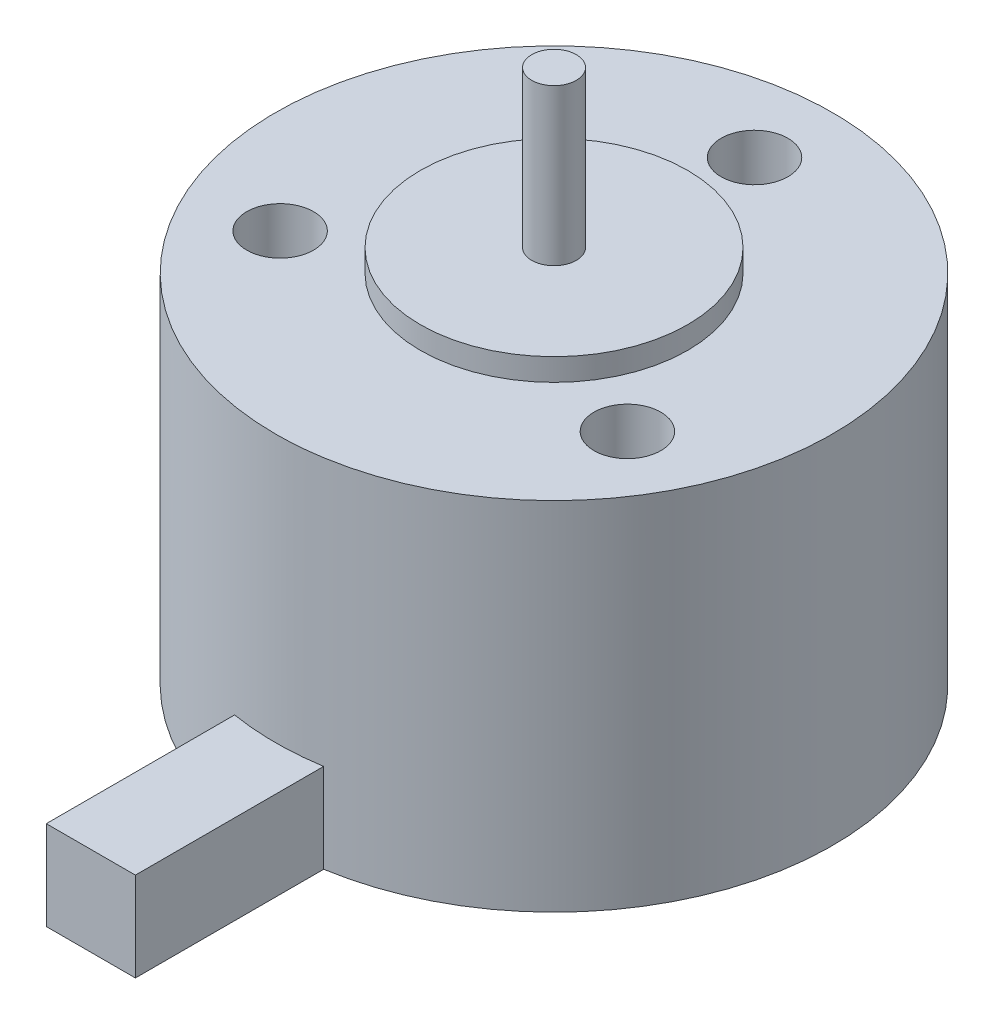
ISO-10303-21;
HEADER;
FILE_DESCRIPTION(('STEP AP214'),'2;1');
FILE_NAME('part.step','',(''),(''),'','','');
FILE_SCHEMA(('AUTOMOTIVE_DESIGN { 1 0 10303 214 1 1 1 1 }'));
ENDSEC;
DATA;
#1=APPLICATION_CONTEXT('core data for automotive mechanical design processes');
#2=APPLICATION_PROTOCOL_DEFINITION('international standard','automotive_design',2000,#1);
#3=PRODUCT_CONTEXT('',#1,'mechanical');
#4=PRODUCT('Part','Part','',(#3));
#5=PRODUCT_RELATED_PRODUCT_CATEGORY('part','',(#4));
#6=PRODUCT_DEFINITION_FORMATION('','',#4);
#7=PRODUCT_DEFINITION_CONTEXT('part definition',#1,'design');
#8=PRODUCT_DEFINITION('design','',#6,#7);
#9=PRODUCT_DEFINITION_SHAPE('','',#8);
#10=(LENGTH_UNIT() NAMED_UNIT(*) SI_UNIT(.MILLI.,.METRE.));
#11=(NAMED_UNIT(*) PLANE_ANGLE_UNIT() SI_UNIT($,.RADIAN.));
#12=(NAMED_UNIT(*) SI_UNIT($,.STERADIAN.) SOLID_ANGLE_UNIT());
#13=UNCERTAINTY_MEASURE_WITH_UNIT(LENGTH_MEASURE(1.E-05),#10,'distance_accuracy_value','');
#14=(GEOMETRIC_REPRESENTATION_CONTEXT(3) GLOBAL_UNCERTAINTY_ASSIGNED_CONTEXT((#13)) GLOBAL_UNIT_ASSIGNED_CONTEXT((#10,
#11,#12)) REPRESENTATION_CONTEXT('',''));
#15=CARTESIAN_POINT('',(0.,0.,0.));
#16=DIRECTION('',(0.,0.,1.));
#17=DIRECTION('',(1.,0.,0.));
#18=AXIS2_PLACEMENT_3D('',#15,#16,#17);
#19=CARTESIAN_POINT('',(0.,16.,0.));
#20=DIRECTION('',(0.,1.,0.));
#21=DIRECTION('',(0.,0.,1.));
#22=AXIS2_PLACEMENT_3D('',#19,#20,#21);
#23=PLANE('',#22);
#24=CARTESIAN_POINT('',(0.,16.,0.));
#25=DIRECTION('',(0.,1.,0.));
#26=DIRECTION('',(0.,0.,1.));
#27=AXIS2_PLACEMENT_3D('',#24,#25,#26);
#28=CIRCLE('',#27,12.5);
#29=CARTESIAN_POINT('',(0.,16.,12.5));
#30=VERTEX_POINT('',#29);
#31=EDGE_CURVE('E42',#30,#30,#28,.T.);
#32=ORIENTED_EDGE('',*,*,#31,.T.);
#33=EDGE_LOOP('',(#32));
#34=FACE_BOUND('',#33,.T.);
#35=CARTESIAN_POINT('',(0.,16.,-9.));
#36=DIRECTION('',(0.,1.,0.));
#37=DIRECTION('',(0.,0.,1.));
#38=AXIS2_PLACEMENT_3D('',#35,#36,#37);
#39=CIRCLE('',#38,1.5);
#40=CARTESIAN_POINT('',(0.,16.,-7.5));
#41=VERTEX_POINT('',#40);
#42=EDGE_CURVE('E99',#41,#41,#39,.T.);
#43=ORIENTED_EDGE('',*,*,#42,.F.);
#44=EDGE_LOOP('',(#43));
#45=FACE_BOUND('',#44,.T.);
#46=CARTESIAN_POINT('',(7.79422863405993,16.,4.50000000000004));
#47=DIRECTION('',(0.,1.,0.));
#48=DIRECTION('',(-0.866025403784436,0.,-0.500000000000004));
#49=AXIS2_PLACEMENT_3D('',#46,#47,#48);
#50=CIRCLE('',#49,1.5);
#51=CARTESIAN_POINT('',(6.49519052838327,16.,3.75000000000003));
#52=VERTEX_POINT('',#51);
#53=EDGE_CURVE('E286',#52,#52,#50,.T.);
#54=ORIENTED_EDGE('',*,*,#53,.F.);
#55=EDGE_LOOP('',(#54));
#56=FACE_BOUND('',#55,.T.);
#57=CARTESIAN_POINT('',(-7.79422863405999,16.,4.49999999999993));
#58=DIRECTION('',(0.,1.,0.));
#59=DIRECTION('',(0.866025403784443,0.,-0.499999999999992));
#60=AXIS2_PLACEMENT_3D('',#57,#58,#59);
#61=CIRCLE('',#60,1.5);
#62=CARTESIAN_POINT('',(-6.49519052838332,16.,3.74999999999994));
#63=VERTEX_POINT('',#62);
#64=EDGE_CURVE('E287',#63,#63,#61,.T.);
#65=ORIENTED_EDGE('',*,*,#64,.F.);
#66=EDGE_LOOP('',(#65));
#67=FACE_BOUND('',#66,.T.);
#68=CARTESIAN_POINT('',(0.,16.,0.));
#69=DIRECTION('',(0.,1.,0.));
#70=DIRECTION('',(0.,0.,1.));
#71=AXIS2_PLACEMENT_3D('',#68,#69,#70);
#72=CIRCLE('',#71,6.);
#73=CARTESIAN_POINT('',(0.,16.,6.));
#74=VERTEX_POINT('',#73);
#75=EDGE_CURVE('E278',#74,#74,#72,.T.);
#76=ORIENTED_EDGE('',*,*,#75,.F.);
#77=EDGE_LOOP('',(#76));
#78=FACE_BOUND('',#77,.T.);
#79=ADVANCED_FACE('F33',(#34,#45,#56,#67,#78),#23,.T.);
#80=CARTESIAN_POINT('',(0.,16.,0.));
#81=DIRECTION('',(0.,-1.,0.));
#82=DIRECTION('',(0.,0.,-1.));
#83=AXIS2_PLACEMENT_3D('',#80,#81,#82);
#84=CYLINDRICAL_SURFACE('',#83,12.5);
#85=ORIENTED_EDGE('',*,*,#31,.F.);
#86=EDGE_LOOP('',(#85));
#87=FACE_BOUND('',#86,.T.);
#88=CARTESIAN_POINT('',(0.,4.,0.));
#89=DIRECTION('',(0.,-1.,0.));
#90=DIRECTION('',(0.,0.,-1.));
#91=AXIS2_PLACEMENT_3D('',#88,#89,#90);
#92=CIRCLE('',#91,12.5);
#93=CARTESIAN_POINT('',(2.,4.,12.3389626792531));
#94=VERTEX_POINT('',#93);
#95=CARTESIAN_POINT('',(-2.,4.,12.3389626792531));
#96=VERTEX_POINT('',#95);
#97=EDGE_CURVE('E11',#94,#96,#92,.T.);
#98=ORIENTED_EDGE('',*,*,#97,.F.);
#99=DIRECTION('',(0.,-1.,0.));
#100=VECTOR('',#99,1.);
#101=CARTESIAN_POINT('',(2.,16.,12.3389626792531));
#102=LINE('',#101,#100);
#103=CARTESIAN_POINT('',(2.,0.,12.3389626792531));
#104=VERTEX_POINT('',#103);
#105=EDGE_CURVE('E108',#94,#104,#102,.T.);
#106=ORIENTED_EDGE('',*,*,#105,.T.);
#107=CARTESIAN_POINT('',(0.,0.,0.));
#108=DIRECTION('',(0.,1.,0.));
#109=DIRECTION('',(0.,0.,1.));
#110=AXIS2_PLACEMENT_3D('',#107,#108,#109);
#111=CIRCLE('',#110,12.5);
#112=CARTESIAN_POINT('',(-2.,0.,12.3389626792531));
#113=VERTEX_POINT('',#112);
#114=EDGE_CURVE('E113',#104,#113,#111,.T.);
#115=ORIENTED_EDGE('',*,*,#114,.T.);
#116=DIRECTION('',(0.,-1.,0.));
#117=VECTOR('',#116,1.);
#118=CARTESIAN_POINT('',(-2.,16.,12.3389626792531));
#119=LINE('',#118,#117);
#120=EDGE_CURVE('E49',#113,#96,#119,.F.);
#121=ORIENTED_EDGE('',*,*,#120,.T.);
#122=EDGE_LOOP('',(#98,#106,#115,#121));
#123=FACE_BOUND('',#122,.T.);
#124=ADVANCED_FACE('F35',(#87,#123),#84,.T.);
#125=CARTESIAN_POINT('',(0.,0.,0.));
#126=DIRECTION('',(0.,1.,0.));
#127=DIRECTION('',(0.,0.,1.));
#128=AXIS2_PLACEMENT_3D('',#125,#126,#127);
#129=PLANE('',#128);
#130=ORIENTED_EDGE('',*,*,#114,.F.);
#131=DIRECTION('',(0.,0.,1.));
#132=VECTOR('',#131,1.);
#133=CARTESIAN_POINT('',(2.,0.,20.7906290367995));
#134=LINE('',#133,#132);
#135=CARTESIAN_POINT('',(2.,0.,20.7906290367995));
#136=VERTEX_POINT('',#135);
#137=EDGE_CURVE('E96',#104,#136,#134,.T.);
#138=ORIENTED_EDGE('',*,*,#137,.T.);
#139=DIRECTION('',(-1.,0.,0.));
#140=VECTOR('',#139,1.);
#141=CARTESIAN_POINT('',(0.,0.,20.7906290367995));
#142=LINE('',#141,#140);
#143=CARTESIAN_POINT('',(-2.,0.,20.7906290367995));
#144=VERTEX_POINT('',#143);
#145=EDGE_CURVE('E94',#136,#144,#142,.T.);
#146=ORIENTED_EDGE('',*,*,#145,.T.);
#147=DIRECTION('',(0.,0.,-1.));
#148=VECTOR('',#147,1.);
#149=CARTESIAN_POINT('',(-2.,0.,20.7906290367995));
#150=LINE('',#149,#148);
#151=EDGE_CURVE('E78',#144,#113,#150,.T.);
#152=ORIENTED_EDGE('',*,*,#151,.T.);
#153=EDGE_LOOP('',(#130,#138,#146,#152));
#154=FACE_BOUND('',#153,.T.);
#155=ADVANCED_FACE('F118',(#154),#129,.F.);
#156=CARTESIAN_POINT('',(0.,4.,0.));
#157=DIRECTION('',(0.,-1.,0.));
#158=DIRECTION('',(0.,0.,-1.));
#159=AXIS2_PLACEMENT_3D('',#156,#157,#158);
#160=PLANE('',#159);
#161=DIRECTION('',(0.,0.,1.));
#162=VECTOR('',#161,1.);
#163=CARTESIAN_POINT('',(2.,4.,20.7906290367995));
#164=LINE('',#163,#162);
#165=CARTESIAN_POINT('',(2.,4.,20.7906290367995));
#166=VERTEX_POINT('',#165);
#167=EDGE_CURVE('E83',#94,#166,#164,.T.);
#168=ORIENTED_EDGE('',*,*,#167,.F.);
#169=ORIENTED_EDGE('',*,*,#97,.T.);
#170=DIRECTION('',(0.,0.,-1.));
#171=VECTOR('',#170,1.);
#172=CARTESIAN_POINT('',(-2.,4.,20.7906290367995));
#173=LINE('',#172,#171);
#174=CARTESIAN_POINT('',(-2.,4.,20.7906290367995));
#175=VERTEX_POINT('',#174);
#176=EDGE_CURVE('E76',#175,#96,#173,.T.);
#177=ORIENTED_EDGE('',*,*,#176,.F.);
#178=DIRECTION('',(-1.,0.,0.));
#179=VECTOR('',#178,1.);
#180=CARTESIAN_POINT('',(0.,4.,20.7906290367995));
#181=LINE('',#180,#179);
#182=EDGE_CURVE('E89',#166,#175,#181,.T.);
#183=ORIENTED_EDGE('',*,*,#182,.F.);
#184=EDGE_LOOP('',(#168,#169,#177,#183));
#185=FACE_BOUND('',#184,.T.);
#186=ADVANCED_FACE('F88',(#185),#160,.F.);
#187=CARTESIAN_POINT('',(2.,4.,20.7906290367995));
#188=DIRECTION('',(1.,0.,0.));
#189=DIRECTION('',(0.,0.,-1.));
#190=AXIS2_PLACEMENT_3D('',#187,#188,#189);
#191=PLANE('',#190);
#192=ORIENTED_EDGE('',*,*,#105,.F.);
#193=ORIENTED_EDGE('',*,*,#167,.T.);
#194=DIRECTION('',(0.,-1.,0.));
#195=VECTOR('',#194,1.);
#196=CARTESIAN_POINT('',(2.,4.,20.7906290367995));
#197=LINE('',#196,#195);
#198=EDGE_CURVE('E82',#166,#136,#197,.T.);
#199=ORIENTED_EDGE('',*,*,#198,.T.);
#200=ORIENTED_EDGE('',*,*,#137,.F.);
#201=EDGE_LOOP('',(#192,#193,#199,#200));
#202=FACE_BOUND('',#201,.T.);
#203=ADVANCED_FACE('F120',(#202),#191,.T.);
#204=CARTESIAN_POINT('',(-2.,4.,20.7906290367995));
#205=DIRECTION('',(-1.,0.,0.));
#206=DIRECTION('',(0.,0.,1.));
#207=AXIS2_PLACEMENT_3D('',#204,#205,#206);
#208=PLANE('',#207);
#209=ORIENTED_EDGE('',*,*,#120,.F.);
#210=ORIENTED_EDGE('',*,*,#151,.F.);
#211=DIRECTION('',(0.,-1.,0.));
#212=VECTOR('',#211,1.);
#213=CARTESIAN_POINT('',(-2.,4.,20.7906290367995));
#214=LINE('',#213,#212);
#215=EDGE_CURVE('E73',#175,#144,#214,.T.);
#216=ORIENTED_EDGE('',*,*,#215,.F.);
#217=ORIENTED_EDGE('',*,*,#176,.T.);
#218=EDGE_LOOP('',(#209,#210,#216,#217));
#219=FACE_BOUND('',#218,.T.);
#220=ADVANCED_FACE('F75',(#219),#208,.T.);
#221=CARTESIAN_POINT('',(0.,4.,20.7906290367995));
#222=DIRECTION('',(0.,0.,1.));
#223=DIRECTION('',(1.,0.,0.));
#224=AXIS2_PLACEMENT_3D('',#221,#222,#223);
#225=PLANE('',#224);
#226=ORIENTED_EDGE('',*,*,#145,.F.);
#227=ORIENTED_EDGE('',*,*,#198,.F.);
#228=ORIENTED_EDGE('',*,*,#182,.T.);
#229=ORIENTED_EDGE('',*,*,#215,.T.);
#230=EDGE_LOOP('',(#226,#227,#228,#229));
#231=FACE_BOUND('',#230,.T.);
#232=ADVANCED_FACE('F92',(#231),#225,.T.);
#233=CARTESIAN_POINT('',(0.,11.,-9.));
#234=DIRECTION('',(0.,1.,0.));
#235=DIRECTION('',(0.,0.,1.));
#236=AXIS2_PLACEMENT_3D('',#233,#234,#235);
#237=CYLINDRICAL_SURFACE('',#236,1.5);
#238=CARTESIAN_POINT('',(0.,11.,-9.));
#239=DIRECTION('',(0.,1.,0.));
#240=DIRECTION('',(0.,0.,1.));
#241=AXIS2_PLACEMENT_3D('',#238,#239,#240);
#242=CIRCLE('',#241,1.5);
#243=CARTESIAN_POINT('',(0.,11.,-7.5));
#244=VERTEX_POINT('',#243);
#245=EDGE_CURVE('E104',#244,#244,#242,.T.);
#246=ORIENTED_EDGE('',*,*,#245,.F.);
#247=EDGE_LOOP('',(#246));
#248=FACE_BOUND('',#247,.T.);
#249=ORIENTED_EDGE('',*,*,#42,.T.);
#250=EDGE_LOOP('',(#249));
#251=FACE_BOUND('',#250,.T.);
#252=ADVANCED_FACE('F190',(#248,#251),#237,.F.);
#253=CARTESIAN_POINT('',(0.,11.,-9.));
#254=DIRECTION('',(0.,1.,0.));
#255=DIRECTION('',(0.,0.,1.));
#256=AXIS2_PLACEMENT_3D('',#253,#254,#255);
#257=PLANE('',#256);
#258=ORIENTED_EDGE('',*,*,#245,.T.);
#259=EDGE_LOOP('',(#258));
#260=FACE_BOUND('',#259,.T.);
#261=ADVANCED_FACE('F198',(#260),#257,.T.);
#262=CARTESIAN_POINT('',(7.79422863405993,11.,4.50000000000004));
#263=DIRECTION('',(0.,1.,0.));
#264=DIRECTION('',(0.,0.,1.));
#265=AXIS2_PLACEMENT_3D('',#262,#263,#264);
#266=CYLINDRICAL_SURFACE('',#265,1.5);
#267=CARTESIAN_POINT('',(7.79422863405993,11.,4.50000000000004));
#268=DIRECTION('',(0.,1.,0.));
#269=DIRECTION('',(-0.866025403784436,0.,-0.500000000000004));
#270=AXIS2_PLACEMENT_3D('',#267,#268,#269);
#271=CIRCLE('',#270,1.5);
#272=CARTESIAN_POINT('',(6.49519052838327,11.,3.75000000000003));
#273=VERTEX_POINT('',#272);
#274=EDGE_CURVE('E290',#273,#273,#271,.T.);
#275=ORIENTED_EDGE('',*,*,#274,.F.);
#276=EDGE_LOOP('',(#275));
#277=FACE_BOUND('',#276,.T.);
#278=ORIENTED_EDGE('',*,*,#53,.T.);
#279=EDGE_LOOP('',(#278));
#280=FACE_BOUND('',#279,.T.);
#281=ADVANCED_FACE('F208',(#277,#280),#266,.F.);
#282=CARTESIAN_POINT('',(7.79422863405993,11.,4.50000000000004));
#283=DIRECTION('',(0.,1.,0.));
#284=DIRECTION('',(-0.866025403784436,0.,-0.500000000000004));
#285=AXIS2_PLACEMENT_3D('',#282,#283,#284);
#286=PLANE('',#285);
#287=ORIENTED_EDGE('',*,*,#274,.T.);
#288=EDGE_LOOP('',(#287));
#289=FACE_BOUND('',#288,.T.);
#290=ADVANCED_FACE('F218',(#289),#286,.T.);
#291=CARTESIAN_POINT('',(-7.79422863405999,11.,4.49999999999993));
#292=DIRECTION('',(0.,1.,0.));
#293=DIRECTION('',(0.,0.,1.));
#294=AXIS2_PLACEMENT_3D('',#291,#292,#293);
#295=CYLINDRICAL_SURFACE('',#294,1.5);
#296=CARTESIAN_POINT('',(-7.79422863405999,11.,4.49999999999993));
#297=DIRECTION('',(0.,1.,0.));
#298=DIRECTION('',(0.866025403784443,0.,-0.499999999999992));
#299=AXIS2_PLACEMENT_3D('',#296,#297,#298);
#300=CIRCLE('',#299,1.5);
#301=CARTESIAN_POINT('',(-6.49519052838332,11.,3.74999999999994));
#302=VERTEX_POINT('',#301);
#303=EDGE_CURVE('E283',#302,#302,#300,.T.);
#304=ORIENTED_EDGE('',*,*,#303,.F.);
#305=EDGE_LOOP('',(#304));
#306=FACE_BOUND('',#305,.T.);
#307=ORIENTED_EDGE('',*,*,#64,.T.);
#308=EDGE_LOOP('',(#307));
#309=FACE_BOUND('',#308,.T.);
#310=ADVANCED_FACE('F228',(#306,#309),#295,.F.);
#311=CARTESIAN_POINT('',(-7.79422863405999,11.,4.49999999999993));
#312=DIRECTION('',(0.,1.,0.));
#313=DIRECTION('',(0.866025403784443,0.,-0.499999999999992));
#314=AXIS2_PLACEMENT_3D('',#311,#312,#313);
#315=PLANE('',#314);
#316=ORIENTED_EDGE('',*,*,#303,.T.);
#317=EDGE_LOOP('',(#316));
#318=FACE_BOUND('',#317,.T.);
#319=ADVANCED_FACE('F237',(#318),#315,.T.);
#320=CARTESIAN_POINT('',(0.,17.,0.));
#321=DIRECTION('',(0.,1.,0.));
#322=DIRECTION('',(0.,0.,1.));
#323=AXIS2_PLACEMENT_3D('',#320,#321,#322);
#324=PLANE('',#323);
#325=CARTESIAN_POINT('',(0.,17.,0.));
#326=DIRECTION('',(0.,1.,0.));
#327=DIRECTION('',(0.,0.,1.));
#328=AXIS2_PLACEMENT_3D('',#325,#326,#327);
#329=CIRCLE('',#328,6.);
#330=CARTESIAN_POINT('',(0.,17.,6.));
#331=VERTEX_POINT('',#330);
#332=EDGE_CURVE('E275',#331,#331,#329,.T.);
#333=ORIENTED_EDGE('',*,*,#332,.T.);
#334=EDGE_LOOP('',(#333));
#335=FACE_BOUND('',#334,.T.);
#336=CARTESIAN_POINT('',(0.,17.,0.));
#337=DIRECTION('',(0.,1.,0.));
#338=DIRECTION('',(0.,0.,1.));
#339=AXIS2_PLACEMENT_3D('',#336,#337,#338);
#340=CIRCLE('',#339,1.);
#341=CARTESIAN_POINT('',(0.,17.,1.));
#342=VERTEX_POINT('',#341);
#343=EDGE_CURVE('E37',#342,#342,#340,.T.);
#344=ORIENTED_EDGE('',*,*,#343,.F.);
#345=EDGE_LOOP('',(#344));
#346=FACE_BOUND('',#345,.T.);
#347=ADVANCED_FACE('F246',(#335,#346),#324,.T.);
#348=CARTESIAN_POINT('',(0.,17.,0.));
#349=DIRECTION('',(0.,-1.,0.));
#350=DIRECTION('',(0.,0.,-1.));
#351=AXIS2_PLACEMENT_3D('',#348,#349,#350);
#352=CYLINDRICAL_SURFACE('',#351,6.);
#353=ORIENTED_EDGE('',*,*,#332,.F.);
#354=EDGE_LOOP('',(#353));
#355=FACE_BOUND('',#354,.T.);
#356=ORIENTED_EDGE('',*,*,#75,.T.);
#357=EDGE_LOOP('',(#356));
#358=FACE_BOUND('',#357,.T.);
#359=ADVANCED_FACE('F166',(#355,#358),#352,.T.);
#360=CARTESIAN_POINT('',(0.,24.,0.));
#361=DIRECTION('',(0.,1.,0.));
#362=DIRECTION('',(0.,0.,1.));
#363=AXIS2_PLACEMENT_3D('',#360,#361,#362);
#364=PLANE('',#363);
#365=CARTESIAN_POINT('',(0.,24.,0.));
#366=DIRECTION('',(0.,1.,0.));
#367=DIRECTION('',(0.,0.,1.));
#368=AXIS2_PLACEMENT_3D('',#365,#366,#367);
#369=CIRCLE('',#368,1.);
#370=CARTESIAN_POINT('',(0.,24.,1.));
#371=VERTEX_POINT('',#370);
#372=EDGE_CURVE('E110',#371,#371,#369,.T.);
#373=ORIENTED_EDGE('',*,*,#372,.T.);
#374=EDGE_LOOP('',(#373));
#375=FACE_BOUND('',#374,.T.);
#376=ADVANCED_FACE('F156',(#375),#364,.T.);
#377=CARTESIAN_POINT('',(0.,24.,0.));
#378=DIRECTION('',(0.,-1.,0.));
#379=DIRECTION('',(0.,0.,-1.));
#380=AXIS2_PLACEMENT_3D('',#377,#378,#379);
#381=CYLINDRICAL_SURFACE('',#380,1.);
#382=ORIENTED_EDGE('',*,*,#343,.T.);
#383=EDGE_LOOP('',(#382));
#384=FACE_BOUND('',#383,.T.);
#385=ORIENTED_EDGE('',*,*,#372,.F.);
#386=EDGE_LOOP('',(#385));
#387=FACE_BOUND('',#386,.T.);
#388=ADVANCED_FACE('F141',(#384,#387),#381,.T.);
#389=CLOSED_SHELL('',(#79,#124,#155,#186,#203,#220,#232,#252,#261,#281,#290,#310,#319,#347,#359,
#376,#388));
#390=MANIFOLD_SOLID_BREP('B2',#389);
#391=ADVANCED_BREP_SHAPE_REPRESENTATION('',(#18,#390),#14);
#392=SHAPE_DEFINITION_REPRESENTATION(#9,#391);
ENDSEC;
END-ISO-10303-21;
